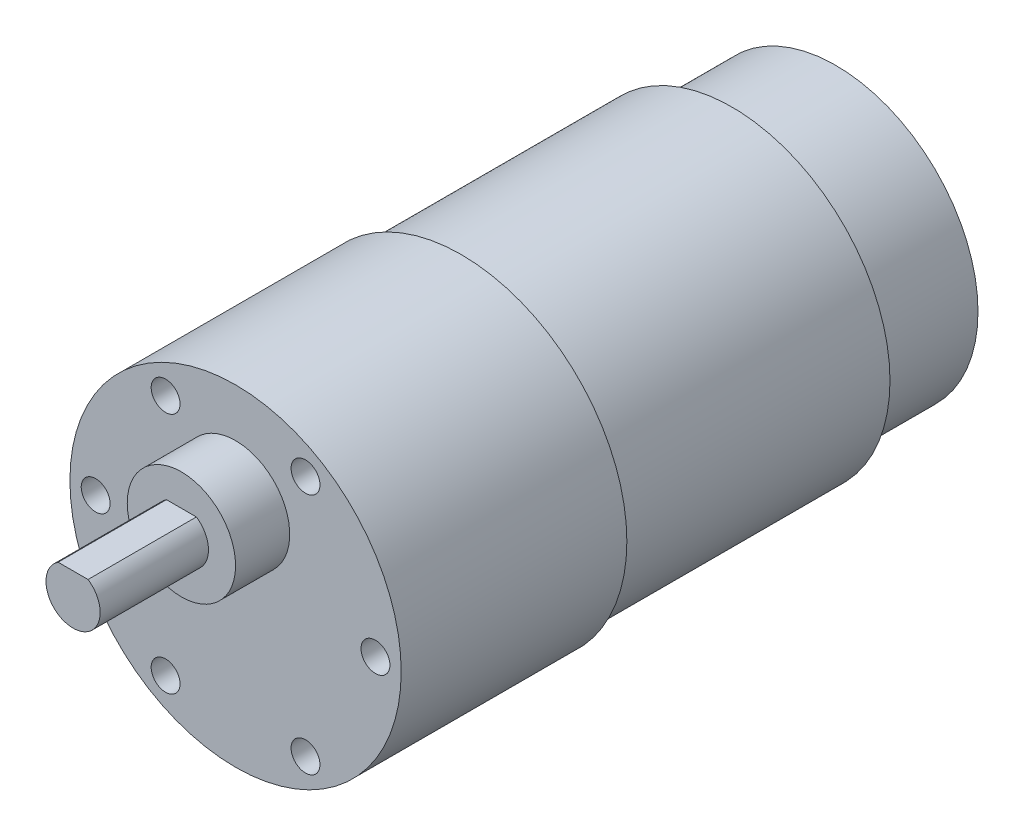
ISO-10303-21;
HEADER;
FILE_DESCRIPTION(('STEP AP214'),'2;1');
FILE_NAME('part.step','',(''),(''),'','','');
FILE_SCHEMA(('AUTOMOTIVE_DESIGN { 1 0 10303 214 1 1 1 1 }'));
ENDSEC;
DATA;
#1=APPLICATION_CONTEXT('core data for automotive mechanical design processes');
#2=APPLICATION_PROTOCOL_DEFINITION('international standard','automotive_design',2000,#1);
#3=PRODUCT_CONTEXT('',#1,'mechanical');
#4=PRODUCT('Part','Part','',(#3));
#5=PRODUCT_RELATED_PRODUCT_CATEGORY('part','',(#4));
#6=PRODUCT_DEFINITION_FORMATION('','',#4);
#7=PRODUCT_DEFINITION_CONTEXT('part definition',#1,'design');
#8=PRODUCT_DEFINITION('design','',#6,#7);
#9=PRODUCT_DEFINITION_SHAPE('','',#8);
#10=(LENGTH_UNIT() NAMED_UNIT(*) SI_UNIT(.MILLI.,.METRE.));
#11=(NAMED_UNIT(*) PLANE_ANGLE_UNIT() SI_UNIT($,.RADIAN.));
#12=(NAMED_UNIT(*) SI_UNIT($,.STERADIAN.) SOLID_ANGLE_UNIT());
#13=UNCERTAINTY_MEASURE_WITH_UNIT(LENGTH_MEASURE(1.E-05),#10,'distance_accuracy_value','');
#14=(GEOMETRIC_REPRESENTATION_CONTEXT(3) GLOBAL_UNCERTAINTY_ASSIGNED_CONTEXT((#13)) GLOBAL_UNIT_ASSIGNED_CONTEXT((#10,
#11,#12)) REPRESENTATION_CONTEXT('',''));
#15=CARTESIAN_POINT('',(0.,0.,0.));
#16=DIRECTION('',(0.,0.,1.));
#17=DIRECTION('',(1.,0.,0.));
#18=AXIS2_PLACEMENT_3D('',#15,#16,#17);
#19=CARTESIAN_POINT('',(0.,0.,25.));
#20=DIRECTION('',(0.,0.,-1.));
#21=DIRECTION('',(-1.,0.,0.));
#22=AXIS2_PLACEMENT_3D('',#19,#20,#21);
#23=PLANE('',#22);
#24=CARTESIAN_POINT('',(-15.5,-17.5,25.));
#25=DIRECTION('',(0.,0.,1.));
#26=DIRECTION('',(1.,0.,0.));
#27=AXIS2_PLACEMENT_3D('',#24,#25,#26);
#28=CIRCLE('',#27,1.60000000000001);
#29=CARTESIAN_POINT('',(-13.9,-17.5,25.));
#30=VERTEX_POINT('',#29);
#31=EDGE_CURVE('E81',#30,#30,#28,.T.);
#32=ORIENTED_EDGE('',*,*,#31,.F.);
#33=EDGE_LOOP('',(#32));
#34=FACE_BOUND('',#33,.T.);
#35=CARTESIAN_POINT('',(7.75,-30.9233937586588,25.));
#36=DIRECTION('',(0.,0.,1.));
#37=DIRECTION('',(1.,0.,0.));
#38=AXIS2_PLACEMENT_3D('',#35,#36,#37);
#39=CIRCLE('',#38,1.6);
#40=CARTESIAN_POINT('',(9.35,-30.9233937586588,25.));
#41=VERTEX_POINT('',#40);
#42=EDGE_CURVE('E143',#41,#41,#39,.T.);
#43=ORIENTED_EDGE('',*,*,#42,.F.);
#44=EDGE_LOOP('',(#43));
#45=FACE_BOUND('',#44,.T.);
#46=CARTESIAN_POINT('',(-7.75,-4.0766062413412,25.));
#47=DIRECTION('',(0.,0.,1.));
#48=DIRECTION('',(1.,0.,0.));
#49=AXIS2_PLACEMENT_3D('',#46,#47,#48);
#50=CIRCLE('',#49,1.6);
#51=CARTESIAN_POINT('',(-6.15,-4.0766062413412,25.));
#52=VERTEX_POINT('',#51);
#53=EDGE_CURVE('E147',#52,#52,#50,.T.);
#54=ORIENTED_EDGE('',*,*,#53,.F.);
#55=EDGE_LOOP('',(#54));
#56=FACE_BOUND('',#55,.T.);
#57=CARTESIAN_POINT('',(0.,-10.5,25.));
#58=DIRECTION('',(0.,0.,-1.));
#59=DIRECTION('',(-1.,0.,0.));
#60=AXIS2_PLACEMENT_3D('',#57,#58,#59);
#61=CIRCLE('',#60,6.);
#62=CARTESIAN_POINT('',(-6.,-10.5,25.));
#63=VERTEX_POINT('',#62);
#64=EDGE_CURVE('E84',#63,#63,#61,.F.);
#65=ORIENTED_EDGE('',*,*,#64,.F.);
#66=EDGE_LOOP('',(#65));
#67=FACE_BOUND('',#66,.T.);
#68=CARTESIAN_POINT('',(0.,-17.5,25.));
#69=DIRECTION('',(0.,0.,1.));
#70=DIRECTION('',(1.,0.,0.));
#71=AXIS2_PLACEMENT_3D('',#68,#69,#70);
#72=CIRCLE('',#71,18.35);
#73=CARTESIAN_POINT('',(18.35,-17.5,25.));
#74=VERTEX_POINT('',#73);
#75=EDGE_CURVE('E87',#74,#74,#72,.T.);
#76=ORIENTED_EDGE('',*,*,#75,.T.);
#77=EDGE_LOOP('',(#76));
#78=FACE_BOUND('',#77,.T.);
#79=CARTESIAN_POINT('',(7.75,-4.0766062413412,25.));
#80=DIRECTION('',(0.,0.,1.));
#81=DIRECTION('',(1.,0.,0.));
#82=AXIS2_PLACEMENT_3D('',#79,#80,#81);
#83=CIRCLE('',#82,1.6);
#84=CARTESIAN_POINT('',(9.35,-4.0766062413412,25.));
#85=VERTEX_POINT('',#84);
#86=EDGE_CURVE('E389',#85,#85,#83,.F.);
#87=ORIENTED_EDGE('',*,*,#86,.T.);
#88=EDGE_LOOP('',(#87));
#89=FACE_BOUND('',#88,.T.);
#90=CARTESIAN_POINT('',(15.5,-17.5,25.));
#91=DIRECTION('',(0.,0.,1.));
#92=DIRECTION('',(1.,0.,0.));
#93=AXIS2_PLACEMENT_3D('',#90,#91,#92);
#94=CIRCLE('',#93,1.60000000000001);
#95=CARTESIAN_POINT('',(17.1,-17.5,25.));
#96=VERTEX_POINT('',#95);
#97=EDGE_CURVE('E399',#96,#96,#94,.F.);
#98=ORIENTED_EDGE('',*,*,#97,.T.);
#99=EDGE_LOOP('',(#98));
#100=FACE_BOUND('',#99,.T.);
#101=CARTESIAN_POINT('',(-7.75,-30.9233937586588,25.));
#102=DIRECTION('',(0.,0.,1.));
#103=DIRECTION('',(1.,0.,0.));
#104=AXIS2_PLACEMENT_3D('',#101,#102,#103);
#105=CIRCLE('',#104,1.6);
#106=CARTESIAN_POINT('',(-6.15,-30.9233937586588,25.));
#107=VERTEX_POINT('',#106);
#108=EDGE_CURVE('E376',#107,#107,#105,.F.);
#109=ORIENTED_EDGE('',*,*,#108,.T.);
#110=EDGE_LOOP('',(#109));
#111=FACE_BOUND('',#110,.T.);
#112=ADVANCED_FACE('F47',(#34,#45,#56,#67,#78,#89,#100,#111),#23,.F.);
#113=CARTESIAN_POINT('',(0.,-17.5,25.));
#114=DIRECTION('',(0.,0.,1.));
#115=DIRECTION('',(1.,0.,0.));
#116=AXIS2_PLACEMENT_3D('',#113,#114,#115);
#117=CYLINDRICAL_SURFACE('',#116,18.35);
#118=ORIENTED_EDGE('',*,*,#75,.F.);
#119=EDGE_LOOP('',(#118));
#120=FACE_BOUND('',#119,.T.);
#121=CARTESIAN_POINT('',(0.,-17.5,0.));
#122=DIRECTION('',(0.,0.,1.));
#123=DIRECTION('',(1.,0.,0.));
#124=AXIS2_PLACEMENT_3D('',#121,#122,#123);
#125=CIRCLE('',#124,18.35);
#126=CARTESIAN_POINT('',(18.35,-17.5,0.));
#127=VERTEX_POINT('',#126);
#128=EDGE_CURVE('E107',#127,#127,#125,.T.);
#129=ORIENTED_EDGE('',*,*,#128,.T.);
#130=EDGE_LOOP('',(#129));
#131=FACE_BOUND('',#130,.T.);
#132=ADVANCED_FACE('F115',(#120,#131),#117,.T.);
#133=CARTESIAN_POINT('',(0.,0.,0.));
#134=DIRECTION('',(0.,0.,-1.));
#135=DIRECTION('',(-1.,0.,0.));
#136=AXIS2_PLACEMENT_3D('',#133,#134,#135);
#137=PLANE('',#136);
#138=CARTESIAN_POINT('',(0.,-17.5,0.));
#139=DIRECTION('',(0.,0.,1.));
#140=DIRECTION('',(1.,0.,0.));
#141=AXIS2_PLACEMENT_3D('',#138,#139,#140);
#142=CIRCLE('',#141,17.5);
#143=CARTESIAN_POINT('',(17.5,-17.5,0.));
#144=VERTEX_POINT('',#143);
#145=EDGE_CURVE('E104',#144,#144,#142,.T.);
#146=ORIENTED_EDGE('',*,*,#145,.T.);
#147=EDGE_LOOP('',(#146));
#148=FACE_BOUND('',#147,.T.);
#149=ORIENTED_EDGE('',*,*,#128,.F.);
#150=EDGE_LOOP('',(#149));
#151=FACE_BOUND('',#150,.T.);
#152=ADVANCED_FACE('F118',(#148,#151),#137,.T.);
#153=CARTESIAN_POINT('',(0.,-17.5,25.));
#154=DIRECTION('',(0.,0.,1.));
#155=DIRECTION('',(1.,0.,0.));
#156=AXIS2_PLACEMENT_3D('',#153,#154,#155);
#157=CYLINDRICAL_SURFACE('',#156,17.5);
#158=CARTESIAN_POINT('',(0.,-17.5,-30.));
#159=DIRECTION('',(0.,0.,1.));
#160=DIRECTION('',(1.,0.,0.));
#161=AXIS2_PLACEMENT_3D('',#158,#159,#160);
#162=CIRCLE('',#161,17.5);
#163=CARTESIAN_POINT('',(17.5,-17.5,-30.));
#164=VERTEX_POINT('',#163);
#165=EDGE_CURVE('E101',#164,#164,#162,.T.);
#166=ORIENTED_EDGE('',*,*,#165,.T.);
#167=EDGE_LOOP('',(#166));
#168=FACE_BOUND('',#167,.T.);
#169=ORIENTED_EDGE('',*,*,#145,.F.);
#170=EDGE_LOOP('',(#169));
#171=FACE_BOUND('',#170,.T.);
#172=ADVANCED_FACE('F122',(#168,#171),#157,.T.);
#173=CARTESIAN_POINT('',(0.,0.,-30.));
#174=DIRECTION('',(0.,0.,1.));
#175=DIRECTION('',(1.,0.,0.));
#176=AXIS2_PLACEMENT_3D('',#173,#174,#175);
#177=PLANE('',#176);
#178=ORIENTED_EDGE('',*,*,#165,.F.);
#179=EDGE_LOOP('',(#178));
#180=FACE_BOUND('',#179,.T.);
#181=CARTESIAN_POINT('',(0.,-17.5,-30.));
#182=DIRECTION('',(0.,0.,1.));
#183=DIRECTION('',(1.,0.,0.));
#184=AXIS2_PLACEMENT_3D('',#181,#182,#183);
#185=CIRCLE('',#184,15.75);
#186=CARTESIAN_POINT('',(15.75,-17.5,-30.));
#187=VERTEX_POINT('',#186);
#188=EDGE_CURVE('E98',#187,#187,#185,.T.);
#189=ORIENTED_EDGE('',*,*,#188,.T.);
#190=EDGE_LOOP('',(#189));
#191=FACE_BOUND('',#190,.T.);
#192=ADVANCED_FACE('F128',(#180,#191),#177,.F.);
#193=CARTESIAN_POINT('',(0.,-17.5,25.));
#194=DIRECTION('',(0.,0.,1.));
#195=DIRECTION('',(1.,0.,0.));
#196=AXIS2_PLACEMENT_3D('',#193,#194,#195);
#197=CYLINDRICAL_SURFACE('',#196,15.75);
#198=CARTESIAN_POINT('',(0.,-17.5,-41.5));
#199=DIRECTION('',(0.,0.,1.));
#200=DIRECTION('',(1.,0.,0.));
#201=AXIS2_PLACEMENT_3D('',#198,#199,#200);
#202=CIRCLE('',#201,15.75);
#203=CARTESIAN_POINT('',(15.75,-17.5,-41.5));
#204=VERTEX_POINT('',#203);
#205=EDGE_CURVE('E95',#204,#204,#202,.T.);
#206=ORIENTED_EDGE('',*,*,#205,.T.);
#207=EDGE_LOOP('',(#206));
#208=FACE_BOUND('',#207,.T.);
#209=ORIENTED_EDGE('',*,*,#188,.F.);
#210=EDGE_LOOP('',(#209));
#211=FACE_BOUND('',#210,.T.);
#212=ADVANCED_FACE('F159',(#208,#211),#197,.T.);
#213=CARTESIAN_POINT('',(0.,0.,-41.5));
#214=DIRECTION('',(0.,0.,-1.));
#215=DIRECTION('',(-1.,0.,0.));
#216=AXIS2_PLACEMENT_3D('',#213,#214,#215);
#217=PLANE('',#216);
#218=ORIENTED_EDGE('',*,*,#205,.F.);
#219=EDGE_LOOP('',(#218));
#220=FACE_BOUND('',#219,.T.);
#221=ADVANCED_FACE('F151',(#220),#217,.T.);
#222=CARTESIAN_POINT('',(0.,-10.5,31.));
#223=DIRECTION('',(0.,0.,-1.));
#224=DIRECTION('',(-1.,0.,0.));
#225=AXIS2_PLACEMENT_3D('',#222,#223,#224);
#226=CYLINDRICAL_SURFACE('',#225,6.);
#227=CARTESIAN_POINT('',(0.,-10.5,31.));
#228=DIRECTION('',(0.,0.,1.));
#229=DIRECTION('',(1.,0.,0.));
#230=AXIS2_PLACEMENT_3D('',#227,#228,#229);
#231=CIRCLE('',#230,6.);
#232=CARTESIAN_POINT('',(6.,-10.5,31.));
#233=VERTEX_POINT('',#232);
#234=EDGE_CURVE('E92',#233,#233,#231,.T.);
#235=ORIENTED_EDGE('',*,*,#234,.F.);
#236=EDGE_LOOP('',(#235));
#237=FACE_BOUND('',#236,.T.);
#238=ORIENTED_EDGE('',*,*,#64,.T.);
#239=EDGE_LOOP('',(#238));
#240=FACE_BOUND('',#239,.T.);
#241=ADVANCED_FACE('F150',(#237,#240),#226,.T.);
#242=CARTESIAN_POINT('',(0.,-10.5,31.));
#243=DIRECTION('',(0.,0.,1.));
#244=DIRECTION('',(1.,0.,0.));
#245=AXIS2_PLACEMENT_3D('',#242,#243,#244);
#246=PLANE('',#245);
#247=CARTESIAN_POINT('',(0.,-10.5,31.));
#248=DIRECTION('',(0.,0.,1.));
#249=DIRECTION('',(1.,0.,0.));
#250=AXIS2_PLACEMENT_3D('',#247,#248,#249);
#251=CIRCLE('',#250,3.);
#252=CARTESIAN_POINT('',(-1.6583123951777,-8.,31.));
#253=VERTEX_POINT('',#252);
#254=CARTESIAN_POINT('',(1.6583123951777,-8.,31.));
#255=VERTEX_POINT('',#254);
#256=EDGE_CURVE('E55',#253,#255,#251,.T.);
#257=ORIENTED_EDGE('',*,*,#256,.F.);
#258=DIRECTION('',(-1.,0.,0.));
#259=VECTOR('',#258,1.);
#260=CARTESIAN_POINT('',(-1.6583123951777,-8.,31.));
#261=LINE('',#260,#259);
#262=EDGE_CURVE('E71',#255,#253,#261,.T.);
#263=ORIENTED_EDGE('',*,*,#262,.F.);
#264=EDGE_LOOP('',(#257,#263));
#265=FACE_BOUND('',#264,.T.);
#266=ORIENTED_EDGE('',*,*,#234,.T.);
#267=EDGE_LOOP('',(#266));
#268=FACE_BOUND('',#267,.T.);
#269=ADVANCED_FACE('F79',(#265,#268),#246,.T.);
#270=CARTESIAN_POINT('',(0.,-10.5,43.));
#271=DIRECTION('',(0.,0.,-1.));
#272=DIRECTION('',(-1.,0.,0.));
#273=AXIS2_PLACEMENT_3D('',#270,#271,#272);
#274=CYLINDRICAL_SURFACE('',#273,3.);
#275=CARTESIAN_POINT('',(0.,-10.5,43.));
#276=DIRECTION('',(0.,0.,1.));
#277=DIRECTION('',(1.,0.,0.));
#278=AXIS2_PLACEMENT_3D('',#275,#276,#277);
#279=CIRCLE('',#278,3.);
#280=CARTESIAN_POINT('',(-1.6583123951777,-8.,43.));
#281=VERTEX_POINT('',#280);
#282=CARTESIAN_POINT('',(1.6583123951777,-8.,43.));
#283=VERTEX_POINT('',#282);
#284=EDGE_CURVE('E90',#281,#283,#279,.T.);
#285=ORIENTED_EDGE('',*,*,#284,.F.);
#286=DIRECTION('',(0.,0.,1.));
#287=VECTOR('',#286,1.);
#288=CARTESIAN_POINT('',(-1.6583123951777,-8.,27.6458980337503));
#289=LINE('',#288,#287);
#290=EDGE_CURVE('E60',#253,#281,#289,.T.);
#291=ORIENTED_EDGE('',*,*,#290,.F.);
#292=ORIENTED_EDGE('',*,*,#256,.T.);
#293=DIRECTION('',(0.,0.,1.));
#294=VECTOR('',#293,1.);
#295=CARTESIAN_POINT('',(1.6583123951777,-8.,27.6458980337503));
#296=LINE('',#295,#294);
#297=EDGE_CURVE('E68',#255,#283,#296,.T.);
#298=ORIENTED_EDGE('',*,*,#297,.T.);
#299=EDGE_LOOP('',(#285,#291,#292,#298));
#300=FACE_BOUND('',#299,.T.);
#301=ADVANCED_FACE('F83',(#300),#274,.T.);
#302=CARTESIAN_POINT('',(0.,-10.5,43.));
#303=DIRECTION('',(0.,0.,1.));
#304=DIRECTION('',(1.,0.,0.));
#305=AXIS2_PLACEMENT_3D('',#302,#303,#304);
#306=PLANE('',#305);
#307=DIRECTION('',(1.,0.,0.));
#308=VECTOR('',#307,1.);
#309=CARTESIAN_POINT('',(-1.6583123951777,-8.,43.));
#310=LINE('',#309,#308);
#311=EDGE_CURVE('E11',#281,#283,#310,.T.);
#312=ORIENTED_EDGE('',*,*,#311,.F.);
#313=ORIENTED_EDGE('',*,*,#284,.T.);
#314=EDGE_LOOP('',(#312,#313));
#315=FACE_BOUND('',#314,.T.);
#316=ADVANCED_FACE('F214',(#315),#306,.T.);
#317=CARTESIAN_POINT('',(-7.75,-4.0766062413412,19.));
#318=DIRECTION('',(0.,0.,1.));
#319=DIRECTION('',(1.,0.,0.));
#320=AXIS2_PLACEMENT_3D('',#317,#318,#319);
#321=CYLINDRICAL_SURFACE('',#320,1.6);
#322=CARTESIAN_POINT('',(-7.75,-4.0766062413412,19.));
#323=DIRECTION('',(0.,0.,1.));
#324=DIRECTION('',(1.,0.,0.));
#325=AXIS2_PLACEMENT_3D('',#322,#323,#324);
#326=CIRCLE('',#325,1.6);
#327=CARTESIAN_POINT('',(-6.15,-4.0766062413412,19.));
#328=VERTEX_POINT('',#327);
#329=EDGE_CURVE('E384',#328,#328,#326,.T.);
#330=ORIENTED_EDGE('',*,*,#329,.F.);
#331=EDGE_LOOP('',(#330));
#332=FACE_BOUND('',#331,.T.);
#333=ORIENTED_EDGE('',*,*,#53,.T.);
#334=EDGE_LOOP('',(#333));
#335=FACE_BOUND('',#334,.T.);
#336=ADVANCED_FACE('F222',(#332,#335),#321,.F.);
#337=CARTESIAN_POINT('',(0.,0.,19.));
#338=DIRECTION('',(0.,0.,1.));
#339=DIRECTION('',(1.,0.,0.));
#340=AXIS2_PLACEMENT_3D('',#337,#338,#339);
#341=PLANE('',#340);
#342=ORIENTED_EDGE('',*,*,#329,.T.);
#343=EDGE_LOOP('',(#342));
#344=FACE_BOUND('',#343,.T.);
#345=ADVANCED_FACE('F236',(#344),#341,.T.);
#346=CARTESIAN_POINT('',(7.75,-4.0766062413412,19.));
#347=DIRECTION('',(0.,0.,1.));
#348=DIRECTION('',(1.,0.,0.));
#349=AXIS2_PLACEMENT_3D('',#346,#347,#348);
#350=CYLINDRICAL_SURFACE('',#349,1.6);
#351=CARTESIAN_POINT('',(7.75,-4.0766062413412,19.));
#352=DIRECTION('',(0.,0.,1.));
#353=DIRECTION('',(1.,0.,0.));
#354=AXIS2_PLACEMENT_3D('',#351,#352,#353);
#355=CIRCLE('',#354,1.6);
#356=CARTESIAN_POINT('',(9.35,-4.0766062413412,19.));
#357=VERTEX_POINT('',#356);
#358=EDGE_CURVE('E386',#357,#357,#355,.F.);
#359=ORIENTED_EDGE('',*,*,#358,.T.);
#360=EDGE_LOOP('',(#359));
#361=FACE_BOUND('',#360,.T.);
#362=ORIENTED_EDGE('',*,*,#86,.F.);
#363=EDGE_LOOP('',(#362));
#364=FACE_BOUND('',#363,.T.);
#365=ADVANCED_FACE('F246',(#361,#364),#350,.F.);
#366=CARTESIAN_POINT('',(0.,0.,19.));
#367=DIRECTION('',(0.,0.,1.));
#368=DIRECTION('',(1.,0.,0.));
#369=AXIS2_PLACEMENT_3D('',#366,#367,#368);
#370=PLANE('',#369);
#371=ORIENTED_EDGE('',*,*,#358,.F.);
#372=EDGE_LOOP('',(#371));
#373=FACE_BOUND('',#372,.T.);
#374=ADVANCED_FACE('F259',(#373),#370,.T.);
#375=CARTESIAN_POINT('',(15.5,-17.5,19.));
#376=DIRECTION('',(0.,0.,1.));
#377=DIRECTION('',(1.,0.,0.));
#378=AXIS2_PLACEMENT_3D('',#375,#376,#377);
#379=CYLINDRICAL_SURFACE('',#378,1.60000000000001);
#380=CARTESIAN_POINT('',(15.5,-17.5,19.));
#381=DIRECTION('',(0.,0.,1.));
#382=DIRECTION('',(1.,0.,0.));
#383=AXIS2_PLACEMENT_3D('',#380,#381,#382);
#384=CIRCLE('',#383,1.60000000000001);
#385=CARTESIAN_POINT('',(17.1,-17.5,19.));
#386=VERTEX_POINT('',#385);
#387=EDGE_CURVE('E393',#386,#386,#384,.F.);
#388=ORIENTED_EDGE('',*,*,#387,.T.);
#389=EDGE_LOOP('',(#388));
#390=FACE_BOUND('',#389,.T.);
#391=ORIENTED_EDGE('',*,*,#97,.F.);
#392=EDGE_LOOP('',(#391));
#393=FACE_BOUND('',#392,.T.);
#394=ADVANCED_FACE('F269',(#390,#393),#379,.F.);
#395=CARTESIAN_POINT('',(0.,0.,19.));
#396=DIRECTION('',(0.,0.,1.));
#397=DIRECTION('',(1.,0.,0.));
#398=AXIS2_PLACEMENT_3D('',#395,#396,#397);
#399=PLANE('',#398);
#400=ORIENTED_EDGE('',*,*,#387,.F.);
#401=EDGE_LOOP('',(#400));
#402=FACE_BOUND('',#401,.T.);
#403=ADVANCED_FACE('F282',(#402),#399,.T.);
#404=CARTESIAN_POINT('',(7.75,-30.9233937586588,19.));
#405=DIRECTION('',(0.,0.,1.));
#406=DIRECTION('',(1.,0.,0.));
#407=AXIS2_PLACEMENT_3D('',#404,#405,#406);
#408=CYLINDRICAL_SURFACE('',#407,1.6);
#409=CARTESIAN_POINT('',(7.75,-30.9233937586588,19.));
#410=DIRECTION('',(0.,0.,1.));
#411=DIRECTION('',(1.,0.,0.));
#412=AXIS2_PLACEMENT_3D('',#409,#410,#411);
#413=CIRCLE('',#412,1.6);
#414=CARTESIAN_POINT('',(9.35,-30.9233937586588,19.));
#415=VERTEX_POINT('',#414);
#416=EDGE_CURVE('E402',#415,#415,#413,.T.);
#417=ORIENTED_EDGE('',*,*,#416,.F.);
#418=EDGE_LOOP('',(#417));
#419=FACE_BOUND('',#418,.T.);
#420=ORIENTED_EDGE('',*,*,#42,.T.);
#421=EDGE_LOOP('',(#420));
#422=FACE_BOUND('',#421,.T.);
#423=ADVANCED_FACE('F292',(#419,#422),#408,.F.);
#424=CARTESIAN_POINT('',(0.,0.,19.));
#425=DIRECTION('',(0.,0.,1.));
#426=DIRECTION('',(1.,0.,0.));
#427=AXIS2_PLACEMENT_3D('',#424,#425,#426);
#428=PLANE('',#427);
#429=ORIENTED_EDGE('',*,*,#416,.T.);
#430=EDGE_LOOP('',(#429));
#431=FACE_BOUND('',#430,.T.);
#432=ADVANCED_FACE('F305',(#431),#428,.T.);
#433=CARTESIAN_POINT('',(-7.75,-30.9233937586588,19.));
#434=DIRECTION('',(0.,0.,1.));
#435=DIRECTION('',(1.,0.,0.));
#436=AXIS2_PLACEMENT_3D('',#433,#434,#435);
#437=CYLINDRICAL_SURFACE('',#436,1.6);
#438=CARTESIAN_POINT('',(-7.75,-30.9233937586588,19.));
#439=DIRECTION('',(0.,0.,1.));
#440=DIRECTION('',(1.,0.,0.));
#441=AXIS2_PLACEMENT_3D('',#438,#439,#440);
#442=CIRCLE('',#441,1.6);
#443=CARTESIAN_POINT('',(-6.15,-30.9233937586588,19.));
#444=VERTEX_POINT('',#443);
#445=EDGE_CURVE('E379',#444,#444,#442,.F.);
#446=ORIENTED_EDGE('',*,*,#445,.T.);
#447=EDGE_LOOP('',(#446));
#448=FACE_BOUND('',#447,.T.);
#449=ORIENTED_EDGE('',*,*,#108,.F.);
#450=EDGE_LOOP('',(#449));
#451=FACE_BOUND('',#450,.T.);
#452=ADVANCED_FACE('F315',(#448,#451),#437,.F.);
#453=CARTESIAN_POINT('',(0.,0.,19.));
#454=DIRECTION('',(0.,0.,1.));
#455=DIRECTION('',(1.,0.,0.));
#456=AXIS2_PLACEMENT_3D('',#453,#454,#455);
#457=PLANE('',#456);
#458=ORIENTED_EDGE('',*,*,#445,.F.);
#459=EDGE_LOOP('',(#458));
#460=FACE_BOUND('',#459,.T.);
#461=ADVANCED_FACE('F328',(#460),#457,.T.);
#462=CARTESIAN_POINT('',(-15.5,-17.5,19.));
#463=DIRECTION('',(0.,0.,1.));
#464=DIRECTION('',(1.,0.,0.));
#465=AXIS2_PLACEMENT_3D('',#462,#463,#464);
#466=CYLINDRICAL_SURFACE('',#465,1.60000000000001);
#467=CARTESIAN_POINT('',(-15.5,-17.5,19.));
#468=DIRECTION('',(0.,0.,1.));
#469=DIRECTION('',(1.,0.,0.));
#470=AXIS2_PLACEMENT_3D('',#467,#468,#469);
#471=CIRCLE('',#470,1.60000000000001);
#472=CARTESIAN_POINT('',(-13.9,-17.5,19.));
#473=VERTEX_POINT('',#472);
#474=EDGE_CURVE('E375',#473,#473,#471,.T.);
#475=ORIENTED_EDGE('',*,*,#474,.F.);
#476=EDGE_LOOP('',(#475));
#477=FACE_BOUND('',#476,.T.);
#478=ORIENTED_EDGE('',*,*,#31,.T.);
#479=EDGE_LOOP('',(#478));
#480=FACE_BOUND('',#479,.T.);
#481=ADVANCED_FACE('F338',(#477,#480),#466,.F.);
#482=CARTESIAN_POINT('',(0.,0.,19.));
#483=DIRECTION('',(0.,0.,1.));
#484=DIRECTION('',(1.,0.,0.));
#485=AXIS2_PLACEMENT_3D('',#482,#483,#484);
#486=PLANE('',#485);
#487=ORIENTED_EDGE('',*,*,#474,.T.);
#488=EDGE_LOOP('',(#487));
#489=FACE_BOUND('',#488,.T.);
#490=ADVANCED_FACE('F351',(#489),#486,.T.);
#491=CARTESIAN_POINT('',(-1.6583123951777,-8.,27.6458980337503));
#492=DIRECTION('',(0.,-1.,0.));
#493=DIRECTION('',(0.,0.,-1.));
#494=AXIS2_PLACEMENT_3D('',#491,#492,#493);
#495=PLANE('',#494);
#496=ORIENTED_EDGE('',*,*,#311,.T.);
#497=ORIENTED_EDGE('',*,*,#297,.F.);
#498=ORIENTED_EDGE('',*,*,#262,.T.);
#499=ORIENTED_EDGE('',*,*,#290,.T.);
#500=EDGE_LOOP('',(#496,#497,#498,#499));
#501=FACE_BOUND('',#500,.T.);
#502=ADVANCED_FACE('F70',(#501),#495,.F.);
#503=CLOSED_SHELL('',(#112,#132,#152,#172,#192,#212,#221,#241,#269,#301,#316,#336,#345,#365,
#374,#394,#403,#423,#432,#452,#461,#481,#490,#502));
#504=MANIFOLD_SOLID_BREP('B2',#503);
#505=ADVANCED_BREP_SHAPE_REPRESENTATION('',(#18,#504),#14);
#506=SHAPE_DEFINITION_REPRESENTATION(#9,#505);
ENDSEC;
END-ISO-10303-21;
